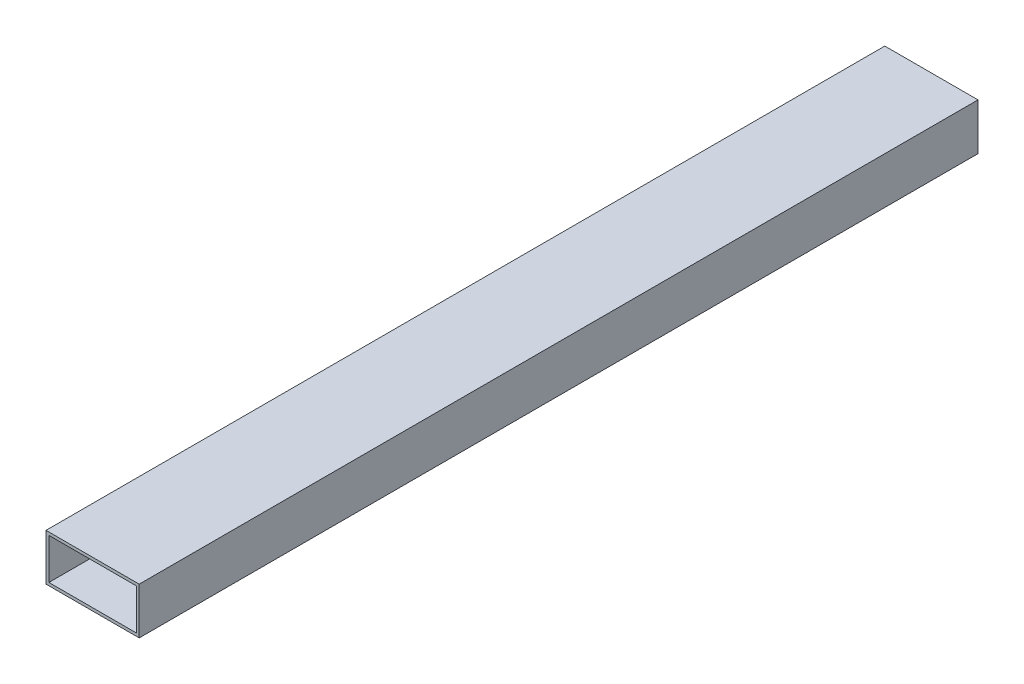
ISO-10303-21;
HEADER;
FILE_DESCRIPTION(('STEP AP214'),'2;1');
FILE_NAME('part.step','',(''),(''),'','','');
FILE_SCHEMA(('AUTOMOTIVE_DESIGN { 1 0 10303 214 1 1 1 1 }'));
ENDSEC;
DATA;
#1=APPLICATION_CONTEXT('core data for automotive mechanical design processes');
#2=APPLICATION_PROTOCOL_DEFINITION('international standard','automotive_design',2000,#1);
#3=PRODUCT_CONTEXT('',#1,'mechanical');
#4=PRODUCT('Part','Part','',(#3));
#5=PRODUCT_RELATED_PRODUCT_CATEGORY('part','',(#4));
#6=PRODUCT_DEFINITION_FORMATION('','',#4);
#7=PRODUCT_DEFINITION_CONTEXT('part definition',#1,'design');
#8=PRODUCT_DEFINITION('design','',#6,#7);
#9=PRODUCT_DEFINITION_SHAPE('','',#8);
#10=(LENGTH_UNIT() NAMED_UNIT(*) SI_UNIT(.MILLI.,.METRE.));
#11=(NAMED_UNIT(*) PLANE_ANGLE_UNIT() SI_UNIT($,.RADIAN.));
#12=(NAMED_UNIT(*) SI_UNIT($,.STERADIAN.) SOLID_ANGLE_UNIT());
#13=UNCERTAINTY_MEASURE_WITH_UNIT(LENGTH_MEASURE(1.E-05),#10,'distance_accuracy_value','');
#14=(GEOMETRIC_REPRESENTATION_CONTEXT(3) GLOBAL_UNCERTAINTY_ASSIGNED_CONTEXT((#13)) GLOBAL_UNIT_ASSIGNED_CONTEXT((#10,
#11,#12)) REPRESENTATION_CONTEXT('',''));
#15=CARTESIAN_POINT('',(0.,0.,0.));
#16=DIRECTION('',(0.,0.,1.));
#17=DIRECTION('',(1.,0.,0.));
#18=AXIS2_PLACEMENT_3D('',#15,#16,#17);
#19=CARTESIAN_POINT('',(0.,0.,228.6));
#20=DIRECTION('',(0.,0.,1.));
#21=DIRECTION('',(1.,0.,0.));
#22=AXIS2_PLACEMENT_3D('',#19,#20,#21);
#23=PLANE('',#22);
#24=DIRECTION('',(0.,-1.,0.));
#25=VECTOR('',#24,1.);
#26=CARTESIAN_POINT('',(-25.4,12.7,228.6));
#27=LINE('',#26,#25);
#28=CARTESIAN_POINT('',(-25.4,12.7,228.6));
#29=VERTEX_POINT('',#28);
#30=CARTESIAN_POINT('',(-25.4,-12.7,228.6));
#31=VERTEX_POINT('',#30);
#32=EDGE_CURVE('E113',#29,#31,#27,.T.);
#33=ORIENTED_EDGE('',*,*,#32,.T.);
#34=DIRECTION('',(1.,0.,0.));
#35=VECTOR('',#34,1.);
#36=CARTESIAN_POINT('',(-25.4,-12.7,228.6));
#37=LINE('',#36,#35);
#38=CARTESIAN_POINT('',(25.4,-12.7,228.6));
#39=VERTEX_POINT('',#38);
#40=EDGE_CURVE('E156',#31,#39,#37,.T.);
#41=ORIENTED_EDGE('',*,*,#40,.T.);
#42=DIRECTION('',(0.,1.,0.));
#43=VECTOR('',#42,1.);
#44=CARTESIAN_POINT('',(25.4,-12.7,228.6));
#45=LINE('',#44,#43);
#46=CARTESIAN_POINT('',(25.4,12.7,228.6));
#47=VERTEX_POINT('',#46);
#48=EDGE_CURVE('E158',#39,#47,#45,.T.);
#49=ORIENTED_EDGE('',*,*,#48,.T.);
#50=DIRECTION('',(-1.,0.,0.));
#51=VECTOR('',#50,1.);
#52=CARTESIAN_POINT('',(25.4,12.7,228.6));
#53=LINE('',#52,#51);
#54=EDGE_CURVE('E60',#47,#29,#53,.T.);
#55=ORIENTED_EDGE('',*,*,#54,.T.);
#56=EDGE_LOOP('',(#33,#41,#49,#55));
#57=FACE_BOUND('',#56,.T.);
#58=DIRECTION('',(1.,0.,0.));
#59=VECTOR('',#58,1.);
#60=CARTESIAN_POINT('',(-23.8125,-11.1125,228.6));
#61=LINE('',#60,#59);
#62=CARTESIAN_POINT('',(-23.8125,-11.1125,228.6));
#63=VERTEX_POINT('',#62);
#64=CARTESIAN_POINT('',(23.8125,-11.1125,228.6));
#65=VERTEX_POINT('',#64);
#66=EDGE_CURVE('E145',#63,#65,#61,.T.);
#67=ORIENTED_EDGE('',*,*,#66,.F.);
#68=DIRECTION('',(0.,-1.,0.));
#69=VECTOR('',#68,1.);
#70=CARTESIAN_POINT('',(-23.8125,11.1125,228.6));
#71=LINE('',#70,#69);
#72=CARTESIAN_POINT('',(-23.8125,11.1125,228.6));
#73=VERTEX_POINT('',#72);
#74=EDGE_CURVE('E110',#73,#63,#71,.T.);
#75=ORIENTED_EDGE('',*,*,#74,.F.);
#76=DIRECTION('',(-1.,0.,0.));
#77=VECTOR('',#76,1.);
#78=CARTESIAN_POINT('',(23.8125,11.1125,228.6));
#79=LINE('',#78,#77);
#80=CARTESIAN_POINT('',(23.8125,11.1125,228.6));
#81=VERTEX_POINT('',#80);
#82=EDGE_CURVE('E149',#81,#73,#79,.T.);
#83=ORIENTED_EDGE('',*,*,#82,.F.);
#84=DIRECTION('',(0.,1.,0.));
#85=VECTOR('',#84,1.);
#86=CARTESIAN_POINT('',(23.8125,-11.1125,228.6));
#87=LINE('',#86,#85);
#88=EDGE_CURVE('E147',#65,#81,#87,.T.);
#89=ORIENTED_EDGE('',*,*,#88,.F.);
#90=EDGE_LOOP('',(#67,#75,#83,#89));
#91=FACE_BOUND('',#90,.T.);
#92=ADVANCED_FACE('F37',(#57,#91),#23,.T.);
#93=CARTESIAN_POINT('',(-25.4,12.7,228.6));
#94=DIRECTION('',(1.,0.,0.));
#95=DIRECTION('',(0.,0.,-1.));
#96=AXIS2_PLACEMENT_3D('',#93,#94,#95);
#97=PLANE('',#96);
#98=DIRECTION('',(0.,0.,-1.));
#99=VECTOR('',#98,1.);
#100=CARTESIAN_POINT('',(-25.4,12.7,228.6));
#101=LINE('',#100,#99);
#102=CARTESIAN_POINT('',(-25.4,12.7,-228.6));
#103=VERTEX_POINT('',#102);
#104=EDGE_CURVE('E161',#29,#103,#101,.T.);
#105=ORIENTED_EDGE('',*,*,#104,.T.);
#106=DIRECTION('',(0.,-1.,0.));
#107=VECTOR('',#106,1.);
#108=CARTESIAN_POINT('',(-25.4,12.7,-228.6));
#109=LINE('',#108,#107);
#110=CARTESIAN_POINT('',(-25.4,-12.7,-228.6));
#111=VERTEX_POINT('',#110);
#112=EDGE_CURVE('E132',#103,#111,#109,.T.);
#113=ORIENTED_EDGE('',*,*,#112,.T.);
#114=DIRECTION('',(0.,0.,-1.));
#115=VECTOR('',#114,1.);
#116=CARTESIAN_POINT('',(-25.4,-12.7,228.6));
#117=LINE('',#116,#115);
#118=EDGE_CURVE('E11',#31,#111,#117,.T.);
#119=ORIENTED_EDGE('',*,*,#118,.F.);
#120=ORIENTED_EDGE('',*,*,#32,.F.);
#121=EDGE_LOOP('',(#105,#113,#119,#120));
#122=FACE_BOUND('',#121,.T.);
#123=ADVANCED_FACE('F39',(#122),#97,.F.);
#124=CARTESIAN_POINT('',(-25.4,-12.7,228.6));
#125=DIRECTION('',(0.,1.,0.));
#126=DIRECTION('',(-1.,0.,0.));
#127=AXIS2_PLACEMENT_3D('',#124,#125,#126);
#128=PLANE('',#127);
#129=ORIENTED_EDGE('',*,*,#118,.T.);
#130=DIRECTION('',(1.,0.,0.));
#131=VECTOR('',#130,1.);
#132=CARTESIAN_POINT('',(-25.4,-12.7,-228.6));
#133=LINE('',#132,#131);
#134=CARTESIAN_POINT('',(25.4,-12.7,-228.6));
#135=VERTEX_POINT('',#134);
#136=EDGE_CURVE('E135',#111,#135,#133,.T.);
#137=ORIENTED_EDGE('',*,*,#136,.T.);
#138=DIRECTION('',(0.,0.,-1.));
#139=VECTOR('',#138,1.);
#140=CARTESIAN_POINT('',(25.4,-12.7,228.6));
#141=LINE('',#140,#139);
#142=EDGE_CURVE('E45',#39,#135,#141,.T.);
#143=ORIENTED_EDGE('',*,*,#142,.F.);
#144=ORIENTED_EDGE('',*,*,#40,.F.);
#145=EDGE_LOOP('',(#129,#137,#143,#144));
#146=FACE_BOUND('',#145,.T.);
#147=ADVANCED_FACE('F174',(#146),#128,.F.);
#148=CARTESIAN_POINT('',(25.4,-12.7,228.6));
#149=DIRECTION('',(-1.,0.,0.));
#150=DIRECTION('',(0.,0.,1.));
#151=AXIS2_PLACEMENT_3D('',#148,#149,#150);
#152=PLANE('',#151);
#153=ORIENTED_EDGE('',*,*,#142,.T.);
#154=DIRECTION('',(0.,1.,0.));
#155=VECTOR('',#154,1.);
#156=CARTESIAN_POINT('',(25.4,-12.7,-228.6));
#157=LINE('',#156,#155);
#158=CARTESIAN_POINT('',(25.4,12.7,-228.6));
#159=VERTEX_POINT('',#158);
#160=EDGE_CURVE('E138',#135,#159,#157,.T.);
#161=ORIENTED_EDGE('',*,*,#160,.T.);
#162=DIRECTION('',(0.,0.,-1.));
#163=VECTOR('',#162,1.);
#164=CARTESIAN_POINT('',(25.4,12.7,228.6));
#165=LINE('',#164,#163);
#166=EDGE_CURVE('E163',#47,#159,#165,.T.);
#167=ORIENTED_EDGE('',*,*,#166,.F.);
#168=ORIENTED_EDGE('',*,*,#48,.F.);
#169=EDGE_LOOP('',(#153,#161,#167,#168));
#170=FACE_BOUND('',#169,.T.);
#171=ADVANCED_FACE('F168',(#170),#152,.F.);
#172=CARTESIAN_POINT('',(25.4,12.7,228.6));
#173=DIRECTION('',(0.,-1.,0.));
#174=DIRECTION('',(1.,0.,0.));
#175=AXIS2_PLACEMENT_3D('',#172,#173,#174);
#176=PLANE('',#175);
#177=ORIENTED_EDGE('',*,*,#166,.T.);
#178=DIRECTION('',(-1.,0.,0.));
#179=VECTOR('',#178,1.);
#180=CARTESIAN_POINT('',(25.4,12.7,-228.6));
#181=LINE('',#180,#179);
#182=EDGE_CURVE('E141',#159,#103,#181,.T.);
#183=ORIENTED_EDGE('',*,*,#182,.T.);
#184=ORIENTED_EDGE('',*,*,#104,.F.);
#185=ORIENTED_EDGE('',*,*,#54,.F.);
#186=EDGE_LOOP('',(#177,#183,#184,#185));
#187=FACE_BOUND('',#186,.T.);
#188=ADVANCED_FACE('F179',(#187),#176,.F.);
#189=CARTESIAN_POINT('',(-23.8125,11.1125,228.6));
#190=DIRECTION('',(1.,0.,0.));
#191=DIRECTION('',(0.,1.,0.));
#192=AXIS2_PLACEMENT_3D('',#189,#190,#191);
#193=PLANE('',#192);
#194=DIRECTION('',(0.,0.,-1.));
#195=VECTOR('',#194,1.);
#196=CARTESIAN_POINT('',(-23.8125,-11.1125,228.6));
#197=LINE('',#196,#195);
#198=CARTESIAN_POINT('',(-23.8125,-11.1125,-228.6));
#199=VERTEX_POINT('',#198);
#200=EDGE_CURVE('E102',#63,#199,#197,.T.);
#201=ORIENTED_EDGE('',*,*,#200,.T.);
#202=DIRECTION('',(0.,-1.,0.));
#203=VECTOR('',#202,1.);
#204=CARTESIAN_POINT('',(-23.8125,11.1125,-228.6));
#205=LINE('',#204,#203);
#206=CARTESIAN_POINT('',(-23.8125,11.1125,-228.6));
#207=VERTEX_POINT('',#206);
#208=EDGE_CURVE('E107',#207,#199,#205,.T.);
#209=ORIENTED_EDGE('',*,*,#208,.F.);
#210=DIRECTION('',(0.,0.,-1.));
#211=VECTOR('',#210,1.);
#212=CARTESIAN_POINT('',(-23.8125,11.1125,228.6));
#213=LINE('',#212,#211);
#214=EDGE_CURVE('E151',#73,#207,#213,.T.);
#215=ORIENTED_EDGE('',*,*,#214,.F.);
#216=ORIENTED_EDGE('',*,*,#74,.T.);
#217=EDGE_LOOP('',(#201,#209,#215,#216));
#218=FACE_BOUND('',#217,.T.);
#219=ADVANCED_FACE('F104',(#218),#193,.T.);
#220=CARTESIAN_POINT('',(-23.8125,-11.1125,228.6));
#221=DIRECTION('',(0.,1.,0.));
#222=DIRECTION('',(0.,0.,1.));
#223=AXIS2_PLACEMENT_3D('',#220,#221,#222);
#224=PLANE('',#223);
#225=DIRECTION('',(0.,0.,-1.));
#226=VECTOR('',#225,1.);
#227=CARTESIAN_POINT('',(23.8125,-11.1125,228.6));
#228=LINE('',#227,#226);
#229=CARTESIAN_POINT('',(23.8125,-11.1125,-228.6));
#230=VERTEX_POINT('',#229);
#231=EDGE_CURVE('E114',#65,#230,#228,.T.);
#232=ORIENTED_EDGE('',*,*,#231,.T.);
#233=DIRECTION('',(1.,0.,0.));
#234=VECTOR('',#233,1.);
#235=CARTESIAN_POINT('',(-23.8125,-11.1125,-228.6));
#236=LINE('',#235,#234);
#237=EDGE_CURVE('E117',#199,#230,#236,.T.);
#238=ORIENTED_EDGE('',*,*,#237,.F.);
#239=ORIENTED_EDGE('',*,*,#200,.F.);
#240=ORIENTED_EDGE('',*,*,#66,.T.);
#241=EDGE_LOOP('',(#232,#238,#239,#240));
#242=FACE_BOUND('',#241,.T.);
#243=ADVANCED_FACE('F118',(#242),#224,.T.);
#244=CARTESIAN_POINT('',(23.8125,-11.1125,228.6));
#245=DIRECTION('',(-1.,0.,0.));
#246=DIRECTION('',(0.,0.,1.));
#247=AXIS2_PLACEMENT_3D('',#244,#245,#246);
#248=PLANE('',#247);
#249=DIRECTION('',(0.,0.,-1.));
#250=VECTOR('',#249,1.);
#251=CARTESIAN_POINT('',(23.8125,11.1125,228.6));
#252=LINE('',#251,#250);
#253=CARTESIAN_POINT('',(23.8125,11.1125,-228.6));
#254=VERTEX_POINT('',#253);
#255=EDGE_CURVE('E52',#81,#254,#252,.T.);
#256=ORIENTED_EDGE('',*,*,#255,.T.);
#257=DIRECTION('',(0.,1.,0.));
#258=VECTOR('',#257,1.);
#259=CARTESIAN_POINT('',(23.8125,-11.1125,-228.6));
#260=LINE('',#259,#258);
#261=EDGE_CURVE('E123',#230,#254,#260,.T.);
#262=ORIENTED_EDGE('',*,*,#261,.F.);
#263=ORIENTED_EDGE('',*,*,#231,.F.);
#264=ORIENTED_EDGE('',*,*,#88,.T.);
#265=EDGE_LOOP('',(#256,#262,#263,#264));
#266=FACE_BOUND('',#265,.T.);
#267=ADVANCED_FACE('F197',(#266),#248,.T.);
#268=CARTESIAN_POINT('',(23.8125,11.1125,228.6));
#269=DIRECTION('',(0.,-1.,0.));
#270=DIRECTION('',(0.,0.,-1.));
#271=AXIS2_PLACEMENT_3D('',#268,#269,#270);
#272=PLANE('',#271);
#273=ORIENTED_EDGE('',*,*,#214,.T.);
#274=DIRECTION('',(-1.,0.,0.));
#275=VECTOR('',#274,1.);
#276=CARTESIAN_POINT('',(23.8125,11.1125,-228.6));
#277=LINE('',#276,#275);
#278=EDGE_CURVE('E127',#254,#207,#277,.T.);
#279=ORIENTED_EDGE('',*,*,#278,.F.);
#280=ORIENTED_EDGE('',*,*,#255,.F.);
#281=ORIENTED_EDGE('',*,*,#82,.T.);
#282=EDGE_LOOP('',(#273,#279,#280,#281));
#283=FACE_BOUND('',#282,.T.);
#284=ADVANCED_FACE('F200',(#283),#272,.T.);
#285=CARTESIAN_POINT('',(0.,0.,-228.6));
#286=DIRECTION('',(0.,0.,1.));
#287=DIRECTION('',(1.,0.,0.));
#288=AXIS2_PLACEMENT_3D('',#285,#286,#287);
#289=PLANE('',#288);
#290=ORIENTED_EDGE('',*,*,#278,.T.);
#291=ORIENTED_EDGE('',*,*,#208,.T.);
#292=ORIENTED_EDGE('',*,*,#237,.T.);
#293=ORIENTED_EDGE('',*,*,#261,.T.);
#294=EDGE_LOOP('',(#290,#291,#292,#293));
#295=FACE_BOUND('',#294,.T.);
#296=ORIENTED_EDGE('',*,*,#112,.F.);
#297=ORIENTED_EDGE('',*,*,#182,.F.);
#298=ORIENTED_EDGE('',*,*,#160,.F.);
#299=ORIENTED_EDGE('',*,*,#136,.F.);
#300=EDGE_LOOP('',(#296,#297,#298,#299));
#301=FACE_BOUND('',#300,.T.);
#302=ADVANCED_FACE('F125',(#295,#301),#289,.F.);
#303=CLOSED_SHELL('',(#92,#123,#147,#171,#188,#219,#243,#267,#284,#302));
#304=MANIFOLD_SOLID_BREP('B2',#303);
#305=ADVANCED_BREP_SHAPE_REPRESENTATION('',(#18,#304),#14);
#306=SHAPE_DEFINITION_REPRESENTATION(#9,#305);
ENDSEC;
END-ISO-10303-21;
